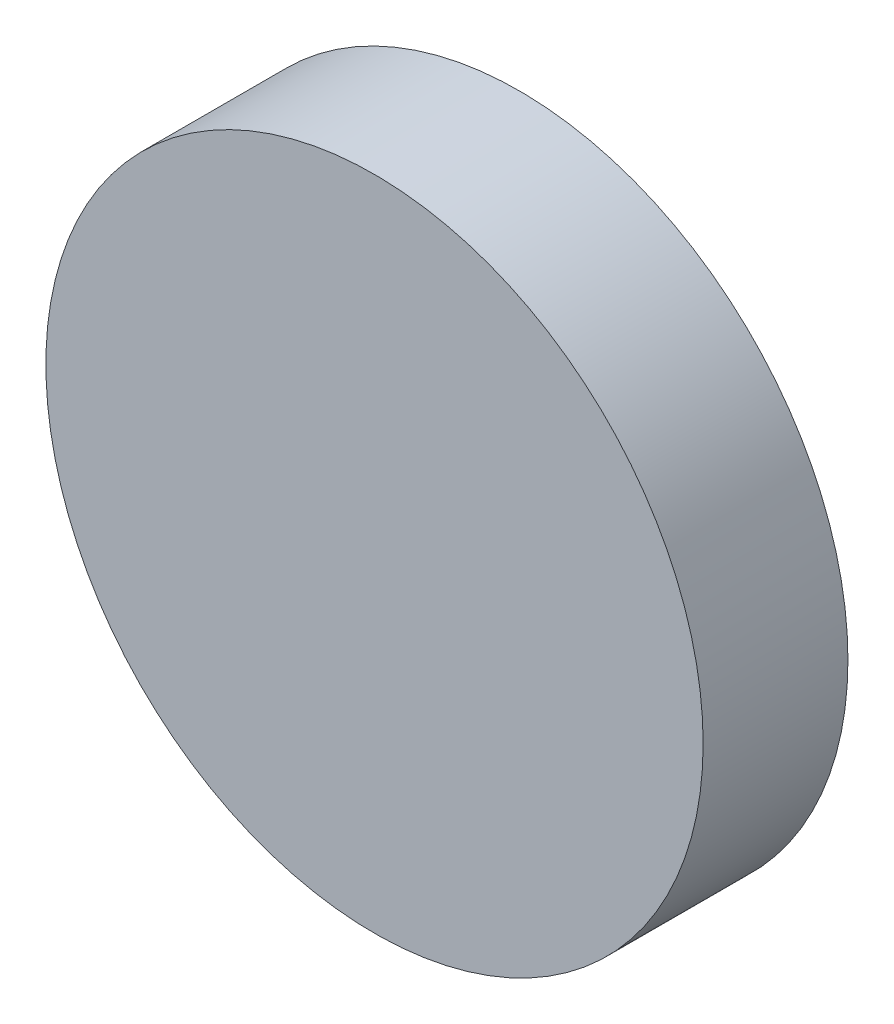
ISO-10303-21;
HEADER;
FILE_DESCRIPTION(('STEP AP214'),'2;1');
FILE_NAME('part.step','',(''),(''),'','','');
FILE_SCHEMA(('AUTOMOTIVE_DESIGN { 1 0 10303 214 1 1 1 1 }'));
ENDSEC;
DATA;
#1=APPLICATION_CONTEXT('core data for automotive mechanical design processes');
#2=APPLICATION_PROTOCOL_DEFINITION('international standard','automotive_design',2000,#1);
#3=PRODUCT_CONTEXT('',#1,'mechanical');
#4=PRODUCT('Part','Part','',(#3));
#5=PRODUCT_RELATED_PRODUCT_CATEGORY('part','',(#4));
#6=PRODUCT_DEFINITION_FORMATION('','',#4);
#7=PRODUCT_DEFINITION_CONTEXT('part definition',#1,'design');
#8=PRODUCT_DEFINITION('design','',#6,#7);
#9=PRODUCT_DEFINITION_SHAPE('','',#8);
#10=(LENGTH_UNIT() NAMED_UNIT(*) SI_UNIT(.MILLI.,.METRE.));
#11=(NAMED_UNIT(*) PLANE_ANGLE_UNIT() SI_UNIT($,.RADIAN.));
#12=(NAMED_UNIT(*) SI_UNIT($,.STERADIAN.) SOLID_ANGLE_UNIT());
#13=UNCERTAINTY_MEASURE_WITH_UNIT(LENGTH_MEASURE(1.E-05),#10,'distance_accuracy_value','');
#14=(GEOMETRIC_REPRESENTATION_CONTEXT(3) GLOBAL_UNCERTAINTY_ASSIGNED_CONTEXT((#13)) GLOBAL_UNIT_ASSIGNED_CONTEXT((#10,
#11,#12)) REPRESENTATION_CONTEXT('',''));
#15=CARTESIAN_POINT('',(0.,0.,0.));
#16=DIRECTION('',(0.,0.,1.));
#17=DIRECTION('',(1.,0.,0.));
#18=AXIS2_PLACEMENT_3D('',#15,#16,#17);
#19=CARTESIAN_POINT('',(0.,0.,10.));
#20=DIRECTION('',(0.,0.,-1.));
#21=DIRECTION('',(-1.,0.,0.));
#22=AXIS2_PLACEMENT_3D('',#19,#20,#21);
#23=CYLINDRICAL_SURFACE('',#22,22.6970490078404);
#24=CARTESIAN_POINT('',(0.,0.,10.));
#25=DIRECTION('',(0.,0.,1.));
#26=DIRECTION('',(1.,0.,0.));
#27=AXIS2_PLACEMENT_3D('',#24,#25,#26);
#28=CIRCLE('',#27,22.6970490078404);
#29=CARTESIAN_POINT('',(22.6970490078404,0.,10.));
#30=VERTEX_POINT('',#29);
#31=EDGE_CURVE('E10',#30,#30,#28,.T.);
#32=ORIENTED_EDGE('',*,*,#31,.F.);
#33=EDGE_LOOP('',(#32));
#34=FACE_BOUND('',#33,.T.);
#35=CARTESIAN_POINT('',(0.,0.,0.));
#36=DIRECTION('',(0.,0.,1.));
#37=DIRECTION('',(1.,0.,0.));
#38=AXIS2_PLACEMENT_3D('',#35,#36,#37);
#39=CIRCLE('',#38,22.6970490078404);
#40=CARTESIAN_POINT('',(22.6970490078404,0.,0.));
#41=VERTEX_POINT('',#40);
#42=EDGE_CURVE('E34',#41,#41,#39,.T.);
#43=ORIENTED_EDGE('',*,*,#42,.T.);
#44=EDGE_LOOP('',(#43));
#45=FACE_BOUND('',#44,.T.);
#46=ADVANCED_FACE('F31',(#34,#45),#23,.T.);
#47=CARTESIAN_POINT('',(0.,0.,10.));
#48=DIRECTION('',(0.,0.,1.));
#49=DIRECTION('',(1.,0.,0.));
#50=AXIS2_PLACEMENT_3D('',#47,#48,#49);
#51=PLANE('',#50);
#52=ORIENTED_EDGE('',*,*,#31,.T.);
#53=EDGE_LOOP('',(#52));
#54=FACE_BOUND('',#53,.T.);
#55=ADVANCED_FACE('F46',(#54),#51,.T.);
#56=CARTESIAN_POINT('',(0.,0.,0.));
#57=DIRECTION('',(0.,0.,1.));
#58=DIRECTION('',(1.,0.,0.));
#59=AXIS2_PLACEMENT_3D('',#56,#57,#58);
#60=PLANE('',#59);
#61=ORIENTED_EDGE('',*,*,#42,.F.);
#62=EDGE_LOOP('',(#61));
#63=FACE_BOUND('',#62,.T.);
#64=ADVANCED_FACE('F44',(#63),#60,.F.);
#65=CLOSED_SHELL('',(#46,#55,#64));
#66=MANIFOLD_SOLID_BREP('B2',#65);
#67=ADVANCED_BREP_SHAPE_REPRESENTATION('',(#18,#66),#14);
#68=SHAPE_DEFINITION_REPRESENTATION(#9,#67);
ENDSEC;
END-ISO-10303-21;
